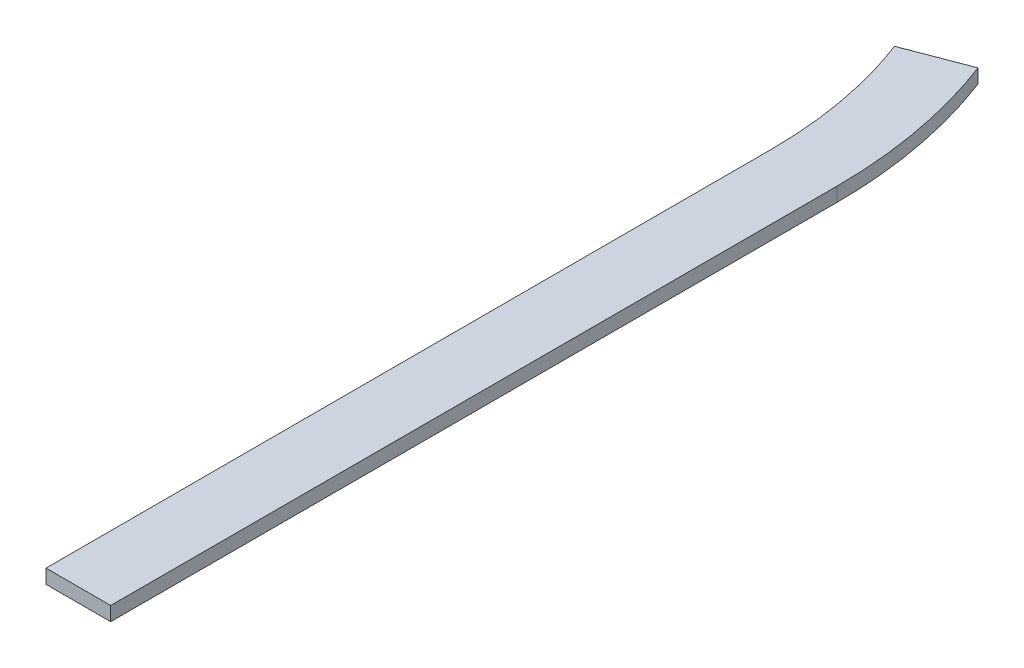
ISO-10303-21;
HEADER;
FILE_DESCRIPTION(('STEP AP214'),'2;1');
FILE_NAME('part.step','',(''),(''),'','','');
FILE_SCHEMA(('AUTOMOTIVE_DESIGN { 1 0 10303 214 1 1 1 1 }'));
ENDSEC;
DATA;
#1=APPLICATION_CONTEXT('core data for automotive mechanical design processes');
#2=APPLICATION_PROTOCOL_DEFINITION('international standard','automotive_design',2000,#1);
#3=PRODUCT_CONTEXT('',#1,'mechanical');
#4=PRODUCT('Part','Part','',(#3));
#5=PRODUCT_RELATED_PRODUCT_CATEGORY('part','',(#4));
#6=PRODUCT_DEFINITION_FORMATION('','',#4);
#7=PRODUCT_DEFINITION_CONTEXT('part definition',#1,'design');
#8=PRODUCT_DEFINITION('design','',#6,#7);
#9=PRODUCT_DEFINITION_SHAPE('','',#8);
#10=(LENGTH_UNIT() NAMED_UNIT(*) SI_UNIT(.MILLI.,.METRE.));
#11=(NAMED_UNIT(*) PLANE_ANGLE_UNIT() SI_UNIT($,.RADIAN.));
#12=(NAMED_UNIT(*) SI_UNIT($,.STERADIAN.) SOLID_ANGLE_UNIT());
#13=UNCERTAINTY_MEASURE_WITH_UNIT(LENGTH_MEASURE(1.E-05),#10,'distance_accuracy_value','');
#14=(GEOMETRIC_REPRESENTATION_CONTEXT(3) GLOBAL_UNCERTAINTY_ASSIGNED_CONTEXT((#13)) GLOBAL_UNIT_ASSIGNED_CONTEXT((#10,
#11,#12)) REPRESENTATION_CONTEXT('',''));
#15=CARTESIAN_POINT('',(0.,0.,0.));
#16=DIRECTION('',(0.,0.,1.));
#17=DIRECTION('',(1.,0.,0.));
#18=AXIS2_PLACEMENT_3D('',#15,#16,#17);
#19=CARTESIAN_POINT('',(206.7634030907,-15.68018349349,-73.80424300401));
#20=DIRECTION('',(-4.15910230364697E-05,-0.999999999135092,5.00949390602796E-08));
#21=DIRECTION('',(0.999999999135094,-4.15910230364697E-05,0.));
#22=AXIS2_PLACEMENT_3D('',#19,#20,#21);
#23=PLANE('',#22);
#24=CARTESIAN_POINT('',(205.25,-15.68010076876,-68.79760276851));
#25=DIRECTION('',(0.,3.89056843341897E-06,0.999999999992432));
#26=VECTOR('',#25,1.);
#27=LINE('',#24,#26);
#28=CARTESIAN_POINT('',(205.249996809638,-15.6801101508344,-68.7976027685095));
#29=VERTEX_POINT('',#28);
#30=CARTESIAN_POINT('',(205.249999997822,-15.6800009406976,-24.4496013270349));
#31=VERTEX_POINT('',#30);
#32=EDGE_CURVE('E119',#29,#31,#27,.T.);
#33=ORIENTED_EDGE('',*,*,#32,.F.);
#34=CARTESIAN_POINT('',(205.249993621888,-15.6801202984345,-68.797602768509));
#35=CARTESIAN_POINT('',(205.246957899715,-15.6801202895716,-71.1410695941202));
#36=CARTESIAN_POINT('',(204.821149917013,-15.6801026952515,-73.4460838303773));
#37=CARTESIAN_POINT('',(204.395440200025,-15.6800851049917,-75.7505661276409));
#38=CARTESIAN_POINT('',(203.560735974791,-15.6800504985152,-77.9409297448925));
#39=B_SPLINE_CURVE_WITH_KNOTS('',2,(#34,#35,#36,#37,#38),.UNSPECIFIED.,.F.,.F.,(3,2,3),(0.,0.5,
1.),.UNSPECIFIED.);
#40=CARTESIAN_POINT('',(203.560735973753,-15.6800756336376,-77.9409297448953));
#41=VERTEX_POINT('',#40);
#42=EDGE_CURVE('E81',#29,#41,#39,.T.);
#43=ORIENTED_EDGE('',*,*,#42,.T.);
#44=CARTESIAN_POINT('',(203.56073597479,-15.6800504985152,-77.9409297448952));
#45=DIRECTION('',(0.934447990730637,-3.88824867322688E-05,-0.356099636489043));
#46=VECTOR('',#45,1.);
#47=LINE('',#44,#46);
#48=CARTESIAN_POINT('',(207.251805539446,-15.6802051394811,-79.3475233092841));
#49=VERTEX_POINT('',#48);
#50=EDGE_CURVE('E77',#41,#49,#47,.T.);
#51=ORIENTED_EDGE('',*,*,#50,.T.);
#52=CARTESIAN_POINT('',(179.4799540302,-15.679048494451,-68.76422031162));
#53=DIRECTION('',(-4.15910230364697E-05,-0.999999999135092,5.00949390602796E-08));
#54=DIRECTION('',(0.999999273767697,-4.15910532052636E-05,-0.00120446430557359));
#55=AXIS2_PLACEMENT_3D('',#52,#53,#54);
#56=ELLIPSE('',#55,29.7200612399551,29.72006121425);
#57=CARTESIAN_POINT('',(209.199995457441,-15.6802746047385,-68.800017063103));
#58=VERTEX_POINT('',#57);
#59=EDGE_CURVE('E97',#58,#49,#56,.F.);
#60=ORIENTED_EDGE('',*,*,#59,.F.);
#61=CARTESIAN_POINT('',(209.199993685712,-15.6802845830993,-68.800017063159));
#62=DIRECTION('',(2.0834252506199E-12,5.00949390130587E-08,0.999999999999999));
#63=VECTOR('',#62,1.);
#64=LINE('',#61,#63);
#65=CARTESIAN_POINT('',(209.199998900663,-15.6801109764647,-24.4503876650559));
#66=VERTEX_POINT('',#65);
#67=EDGE_CURVE('E106',#58,#66,#64,.T.);
#68=ORIENTED_EDGE('',*,*,#67,.T.);
#69=CARTESIAN_POINT('',(205.2500000013,-15.67992822826,-24.4499919375765));
#70=DIRECTION('',(0.999999999733021,-2.31061341652186E-05,2.52064071820565E-07));
#71=VECTOR('',#70,1.);
#72=LINE('',#69,#71);
#73=EDGE_CURVE('E112',#31,#66,#72,.T.);
#74=ORIENTED_EDGE('',*,*,#73,.F.);
#75=EDGE_LOOP('',(#33,#43,#51,#60,#68,#74));
#76=FACE_BOUND('',#75,.T.);
#77=ADVANCED_FACE('F17',(#76),#23,.T.);
#78=CARTESIAN_POINT('',(205.4062707559,-15.25013536053,-78.64422652715));
#79=DIRECTION('',(0.356099636588791,0.,0.934447991501577));
#80=DIRECTION('',(0.934447991501577,0.,-0.356099636588791));
#81=AXIS2_PLACEMENT_3D('',#78,#79,#80);
#82=PLANE('',#81);
#83=DIRECTION('',(0.,-1.,0.));
#84=VECTOR('',#83,1.);
#85=CARTESIAN_POINT('',(203.560735972723,-54.,-77.9409297448989));
#86=LINE('',#85,#84);
#87=CARTESIAN_POINT('',(203.560735972723,-14.8200803371203,-77.9409297449003));
#88=VERTEX_POINT('',#87);
#89=EDGE_CURVE('E74',#41,#88,#86,.F.);
#90=ORIENTED_EDGE('',*,*,#89,.T.);
#91=DIRECTION('',(-0.934447991287621,-2.15334328119046E-05,0.35609963649917));
#92=VECTOR('',#91,1.);
#93=CARTESIAN_POINT('',(207.251805539003,-14.8199952800607,-79.3475233093348));
#94=LINE('',#93,#92);
#95=CARTESIAN_POINT('',(207.251805539227,-14.8199952800607,-79.3475233092347));
#96=VERTEX_POINT('',#95);
#97=EDGE_CURVE('E70',#96,#88,#94,.T.);
#98=ORIENTED_EDGE('',*,*,#97,.F.);
#99=DIRECTION('',(0.,-1.,0.));
#100=VECTOR('',#99,1.);
#101=CARTESIAN_POINT('',(207.251805539289,-54.,-79.3475233090727));
#102=LINE('',#101,#100);
#103=EDGE_CURVE('E95',#49,#96,#102,.F.);
#104=ORIENTED_EDGE('',*,*,#103,.F.);
#105=ORIENTED_EDGE('',*,*,#50,.F.);
#106=EDGE_LOOP('',(#90,#98,#104,#105));
#107=FACE_BOUND('',#106,.T.);
#108=ADVANCED_FACE('F76',(#107),#82,.F.);
#109=CARTESIAN_POINT('',(179.4799540302,-54.,-68.76422031162));
#110=DIRECTION('',(0.,-1.,0.));
#111=DIRECTION('',(0.,0.,-1.));
#112=AXIS2_PLACEMENT_3D('',#109,#110,#111);
#113=CYLINDRICAL_SURFACE('',#112,25.77006121425);
#114=ORIENTED_EDGE('',*,*,#42,.F.);
#115=CARTESIAN_POINT('',(205.25,-14.82013791833,-68.79962056696));
#116=DIRECTION('',(0.,-0.999997247265042,0.00234637216540267));
#117=VECTOR('',#116,1.);
#118=LINE('',#115,#117);
#119=CARTESIAN_POINT('',(205.249995237664,-14.8201274331858,-68.7996205673372));
#120=VERTEX_POINT('',#119);
#121=EDGE_CURVE('E80',#120,#29,#118,.T.);
#122=ORIENTED_EDGE('',*,*,#121,.F.);
#123=CARTESIAN_POINT('',(179.4799540302,-14.8206352550022,-68.76422031162));
#124=DIRECTION('',(-2.01218730416291E-05,0.999999999768156,7.66804759898366E-06));
#125=DIRECTION('',(-0.934447991284949,-2.15334328123437E-05,0.356099636506182));
#126=AXIS2_PLACEMENT_3D('',#123,#124,#125);
#127=ELLIPSE('',#126,25.7700612202246,25.77006121425);
#128=EDGE_CURVE('E84',#88,#120,#127,.F.);
#129=ORIENTED_EDGE('',*,*,#128,.F.);
#130=ORIENTED_EDGE('',*,*,#89,.F.);
#131=EDGE_LOOP('',(#114,#122,#129,#130));
#132=FACE_BOUND('',#131,.T.);
#133=ADVANCED_FACE('F85',(#132),#113,.F.);
#134=CARTESIAN_POINT('',(205.25,-54.,-68.8));
#135=DIRECTION('',(-1.,0.,0.));
#136=DIRECTION('',(0.,0.,1.));
#137=AXIS2_PLACEMENT_3D('',#134,#135,#136);
#138=PLANE('',#137);
#139=CARTESIAN_POINT('',(205.2500000013,-14.82033000151,-24.4499919375765));
#140=DIRECTION('',(0.,-1.,0.));
#141=VECTOR('',#140,1.);
#142=LINE('',#139,#141);
#143=CARTESIAN_POINT('',(205.24999799753,-14.8203933066873,-24.4499919380922));
#144=VERTEX_POINT('',#143);
#145=EDGE_CURVE('E116',#144,#31,#142,.T.);
#146=ORIENTED_EDGE('',*,*,#145,.F.);
#147=DIRECTION('',(0.,-7.66804760053602E-06,0.999999999970601));
#148=VECTOR('',#147,1.);
#149=CARTESIAN_POINT('',(205.25,-14.8200780662749,-73.8042430042435));
#150=LINE('',#149,#148);
#151=EDGE_CURVE('E91',#120,#144,#150,.T.);
#152=ORIENTED_EDGE('',*,*,#151,.F.);
#153=ORIENTED_EDGE('',*,*,#121,.T.);
#154=ORIENTED_EDGE('',*,*,#32,.T.);
#155=EDGE_LOOP('',(#146,#152,#153,#154));
#156=FACE_BOUND('',#155,.T.);
#157=ADVANCED_FACE('F125',(#156),#138,.T.);
#158=CARTESIAN_POINT('',(207.2249999365,-15.24995187667,-24.44999143975));
#159=DIRECTION('',(-2.52064072235992E-07,0.,0.999999999999968));
#160=DIRECTION('',(0.999999999999968,0.,2.52064072235992E-07));
#161=AXIS2_PLACEMENT_3D('',#158,#159,#160);
#162=PLANE('',#161);
#163=ORIENTED_EDGE('',*,*,#73,.T.);
#164=CARTESIAN_POINT('',(209.2000000026,-15.68001949749,-24.4499909419234));
#165=DIRECTION('',(0.,1.,0.));
#166=VECTOR('',#165,1.);
#167=LINE('',#164,#166);
#168=CARTESIAN_POINT('',(209.20000000224,-14.820346211768,-24.4499914264558));
#169=VERTEX_POINT('',#168);
#170=EDGE_CURVE('E104',#66,#169,#167,.T.);
#171=ORIENTED_EDGE('',*,*,#170,.T.);
#172=DIRECTION('',(-0.999999999797555,-2.01218730422207E-05,0.));
#173=VECTOR('',#172,1.);
#174=CARTESIAN_POINT('',(206.763403098315,-14.8204260645163,-24.4499919389501));
#175=LINE('',#174,#173);
#176=EDGE_CURVE('E255',#144,#169,#175,.F.);
#177=ORIENTED_EDGE('',*,*,#176,.F.);
#178=ORIENTED_EDGE('',*,*,#145,.T.);
#179=EDGE_LOOP('',(#163,#171,#177,#178));
#180=FACE_BOUND('',#179,.T.);
#181=ADVANCED_FACE('F144',(#180),#162,.T.);
#182=CARTESIAN_POINT('',(209.2,-54.,-68.8));
#183=DIRECTION('',(-1.,0.,0.));
#184=DIRECTION('',(0.,0.,1.));
#185=AXIS2_PLACEMENT_3D('',#182,#183,#184);
#186=PLANE('',#185);
#187=ORIENTED_EDGE('',*,*,#67,.F.);
#188=CARTESIAN_POINT('',(209.199993686488,-14.82000508524,-68.80001706302));
#189=DIRECTION('',(0.,-1.,0.));
#190=VECTOR('',#189,1.);
#191=LINE('',#188,#190);
#192=CARTESIAN_POINT('',(209.199996842914,-14.820021021318,-68.8000170631422));
#193=VERTEX_POINT('',#192);
#194=EDGE_CURVE('E36',#193,#58,#191,.T.);
#195=ORIENTED_EDGE('',*,*,#194,.F.);
#196=DIRECTION('',(1.54295480268454E-10,-7.6680475974313E-06,0.999999999970601));
#197=VECTOR('',#196,1.);
#198=CARTESIAN_POINT('',(209.199999996625,-14.8199985848764,-73.80424300401));
#199=LINE('',#198,#197);
#200=EDGE_CURVE('E27',#169,#193,#199,.F.);
#201=ORIENTED_EDGE('',*,*,#200,.F.);
#202=ORIENTED_EDGE('',*,*,#170,.F.);
#203=EDGE_LOOP('',(#187,#195,#201,#202));
#204=FACE_BOUND('',#203,.T.);
#205=ADVANCED_FACE('F207',(#204),#186,.F.);
#206=CARTESIAN_POINT('',(179.4799540302,-54.,-68.76422031162));
#207=DIRECTION('',(0.,-1.,0.));
#208=DIRECTION('',(0.,0.,-1.));
#209=AXIS2_PLACEMENT_3D('',#206,#207,#208);
#210=CYLINDRICAL_SURFACE('',#209,29.72006121425);
#211=ORIENTED_EDGE('',*,*,#103,.T.);
#212=CARTESIAN_POINT('',(179.4799540302,-14.8206352550022,-68.76422031162));
#213=DIRECTION('',(-2.01218730416291E-05,0.999999999768156,7.66804759898366E-06));
#214=DIRECTION('',(-0.934447991284949,-2.15334328123437E-05,0.356099636506182));
#215=AXIS2_PLACEMENT_3D('',#212,#213,#214);
#216=ELLIPSE('',#215,29.7200612211404,29.72006121425);
#217=EDGE_CURVE('E11',#193,#96,#216,.T.);
#218=ORIENTED_EDGE('',*,*,#217,.F.);
#219=ORIENTED_EDGE('',*,*,#194,.T.);
#220=ORIENTED_EDGE('',*,*,#59,.T.);
#221=EDGE_LOOP('',(#211,#218,#219,#220));
#222=FACE_BOUND('',#221,.T.);
#223=ADVANCED_FACE('F216',(#222),#210,.T.);
#224=CARTESIAN_POINT('',(206.7634030907,-14.82004761377,-73.80424300401));
#225=DIRECTION('',(-2.01218730416291E-05,0.999999999768156,7.66804759898366E-06));
#226=DIRECTION('',(-0.999999999797555,-2.01218730422207E-05,0.));
#227=AXIS2_PLACEMENT_3D('',#224,#225,#226);
#228=PLANE('',#227);
#229=ORIENTED_EDGE('',*,*,#200,.T.);
#230=ORIENTED_EDGE('',*,*,#217,.T.);
#231=ORIENTED_EDGE('',*,*,#97,.T.);
#232=ORIENTED_EDGE('',*,*,#128,.T.);
#233=ORIENTED_EDGE('',*,*,#151,.T.);
#234=ORIENTED_EDGE('',*,*,#176,.T.);
#235=EDGE_LOOP('',(#229,#230,#231,#232,#233,#234));
#236=FACE_BOUND('',#235,.T.);
#237=ADVANCED_FACE('F94',(#236),#228,.T.);
#238=CLOSED_SHELL('',(#77,#108,#133,#157,#181,#205,#223,#237));
#239=MANIFOLD_SOLID_BREP('B1',#238);
#240=ADVANCED_BREP_SHAPE_REPRESENTATION('',(#18,#239),#14);
#241=SHAPE_DEFINITION_REPRESENTATION(#9,#240);
ENDSEC;
END-ISO-10303-21;
